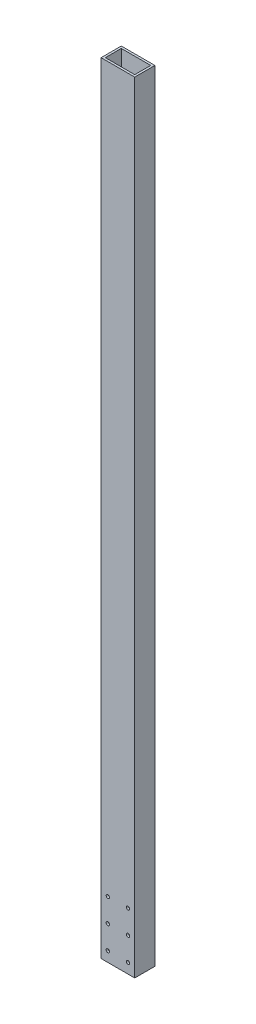
ISO-10303-21;
HEADER;
FILE_DESCRIPTION(('STEP AP214'),'2;1');
FILE_NAME('part.step','',(''),(''),'','','');
FILE_SCHEMA(('AUTOMOTIVE_DESIGN { 1 0 10303 214 1 1 1 1 }'));
ENDSEC;
DATA;
#1=APPLICATION_CONTEXT('core data for automotive mechanical design processes');
#2=APPLICATION_PROTOCOL_DEFINITION('international standard','automotive_design',2000,#1);
#3=PRODUCT_CONTEXT('',#1,'mechanical');
#4=PRODUCT('Part','Part','',(#3));
#5=PRODUCT_RELATED_PRODUCT_CATEGORY('part','',(#4));
#6=PRODUCT_DEFINITION_FORMATION('','',#4);
#7=PRODUCT_DEFINITION_CONTEXT('part definition',#1,'design');
#8=PRODUCT_DEFINITION('design','',#6,#7);
#9=PRODUCT_DEFINITION_SHAPE('','',#8);
#10=(LENGTH_UNIT() NAMED_UNIT(*) SI_UNIT(.MILLI.,.METRE.));
#11=(NAMED_UNIT(*) PLANE_ANGLE_UNIT() SI_UNIT($,.RADIAN.));
#12=(NAMED_UNIT(*) SI_UNIT($,.STERADIAN.) SOLID_ANGLE_UNIT());
#13=UNCERTAINTY_MEASURE_WITH_UNIT(LENGTH_MEASURE(1.E-05),#10,'distance_accuracy_value','');
#14=(GEOMETRIC_REPRESENTATION_CONTEXT(3) GLOBAL_UNCERTAINTY_ASSIGNED_CONTEXT((#13)) GLOBAL_UNIT_ASSIGNED_CONTEXT((#10,
#11,#12)) REPRESENTATION_CONTEXT('',''));
#15=CARTESIAN_POINT('',(0.,0.,0.));
#16=DIRECTION('',(0.,0.,1.));
#17=DIRECTION('',(1.,0.,0.));
#18=AXIS2_PLACEMENT_3D('',#15,#16,#17);
#19=CARTESIAN_POINT('',(0.,1473.2,0.));
#20=DIRECTION('',(0.,1.,0.));
#21=DIRECTION('',(0.,0.,-1.));
#22=AXIS2_PLACEMENT_3D('',#19,#20,#21);
#23=PLANE('',#22);
#24=DIRECTION('',(0.,0.,-1.));
#25=VECTOR('',#24,1.);
#26=CARTESIAN_POINT('',(-77.9742647058824,1473.2,-5.57181372549019));
#27=LINE('',#26,#25);
#28=CARTESIAN_POINT('',(-77.9742647058824,1473.2,32.5281862745098));
#29=VERTEX_POINT('',#28);
#30=CARTESIAN_POINT('',(-77.9742647058824,1473.2,-5.57181372549019));
#31=VERTEX_POINT('',#30);
#32=EDGE_CURVE('E140',#29,#31,#27,.T.);
#33=ORIENTED_EDGE('',*,*,#32,.F.);
#34=DIRECTION('',(-1.,0.,0.));
#35=VECTOR('',#34,1.);
#36=CARTESIAN_POINT('',(-77.9742647058824,1473.2,32.5281862745098));
#37=LINE('',#36,#35);
#38=CARTESIAN_POINT('',(-14.4742647058824,1473.2,32.5281862745098));
#39=VERTEX_POINT('',#38);
#40=EDGE_CURVE('E150',#39,#29,#37,.T.);
#41=ORIENTED_EDGE('',*,*,#40,.F.);
#42=DIRECTION('',(0.,0.,1.));
#43=VECTOR('',#42,1.);
#44=CARTESIAN_POINT('',(-14.4742647058824,1473.2,-5.57181372549019));
#45=LINE('',#44,#43);
#46=CARTESIAN_POINT('',(-14.4742647058824,1473.2,-5.57181372549019));
#47=VERTEX_POINT('',#46);
#48=EDGE_CURVE('E147',#47,#39,#45,.T.);
#49=ORIENTED_EDGE('',*,*,#48,.F.);
#50=DIRECTION('',(1.,0.,0.));
#51=VECTOR('',#50,1.);
#52=CARTESIAN_POINT('',(-77.9742647058824,1473.2,-5.57181372549019));
#53=LINE('',#52,#51);
#54=EDGE_CURVE('E143',#31,#47,#53,.T.);
#55=ORIENTED_EDGE('',*,*,#54,.F.);
#56=EDGE_LOOP('',(#33,#41,#49,#55));
#57=FACE_BOUND('',#56,.T.);
#58=DIRECTION('',(1.,0.,0.));
#59=VECTOR('',#58,1.);
#60=CARTESIAN_POINT('',(0.,1473.2,-1.60941372549019));
#61=LINE('',#60,#59);
#62=CARTESIAN_POINT('',(-74.0118647058824,1473.2,-1.60941372549019));
#63=VERTEX_POINT('',#62);
#64=CARTESIAN_POINT('',(-18.4366647058824,1473.2,-1.60941372549019));
#65=VERTEX_POINT('',#64);
#66=EDGE_CURVE('E119',#63,#65,#61,.T.);
#67=ORIENTED_EDGE('',*,*,#66,.T.);
#68=DIRECTION('',(0.,0.,1.));
#69=VECTOR('',#68,1.);
#70=CARTESIAN_POINT('',(-18.4366647058824,1473.2,0.));
#71=LINE('',#70,#69);
#72=CARTESIAN_POINT('',(-18.4366647058824,1473.2,28.5657862745098));
#73=VERTEX_POINT('',#72);
#74=EDGE_CURVE('E124',#65,#73,#71,.T.);
#75=ORIENTED_EDGE('',*,*,#74,.T.);
#76=DIRECTION('',(-1.,0.,0.));
#77=VECTOR('',#76,1.);
#78=CARTESIAN_POINT('',(0.,1473.2,28.5657862745098));
#79=LINE('',#78,#77);
#80=CARTESIAN_POINT('',(-74.0118647058824,1473.2,28.5657862745098));
#81=VERTEX_POINT('',#80);
#82=EDGE_CURVE('E120',#73,#81,#79,.T.);
#83=ORIENTED_EDGE('',*,*,#82,.T.);
#84=DIRECTION('',(0.,0.,-1.));
#85=VECTOR('',#84,1.);
#86=CARTESIAN_POINT('',(-74.0118647058824,1473.2,0.));
#87=LINE('',#86,#85);
#88=EDGE_CURVE('E105',#81,#63,#87,.T.);
#89=ORIENTED_EDGE('',*,*,#88,.T.);
#90=EDGE_LOOP('',(#67,#75,#83,#89));
#91=FACE_BOUND('',#90,.T.);
#92=ADVANCED_FACE('F37',(#57,#91),#23,.T.);
#93=CARTESIAN_POINT('',(0.,0.,0.));
#94=DIRECTION('',(0.,1.,0.));
#95=DIRECTION('',(0.,0.,-1.));
#96=AXIS2_PLACEMENT_3D('',#93,#94,#95);
#97=PLANE('',#96);
#98=DIRECTION('',(0.,0.,-1.));
#99=VECTOR('',#98,1.);
#100=CARTESIAN_POINT('',(-77.9742647058824,0.,-5.57181372549019));
#101=LINE('',#100,#99);
#102=CARTESIAN_POINT('',(-77.9742647058824,0.,32.5281862745098));
#103=VERTEX_POINT('',#102);
#104=CARTESIAN_POINT('',(-77.9742647058824,0.,-5.57181372549019));
#105=VERTEX_POINT('',#104);
#106=EDGE_CURVE('E113',#103,#105,#101,.T.);
#107=ORIENTED_EDGE('',*,*,#106,.T.);
#108=DIRECTION('',(1.,0.,0.));
#109=VECTOR('',#108,1.);
#110=CARTESIAN_POINT('',(-77.9742647058824,0.,-5.57181372549019));
#111=LINE('',#110,#109);
#112=CARTESIAN_POINT('',(-14.4742647058824,0.,-5.57181372549019));
#113=VERTEX_POINT('',#112);
#114=EDGE_CURVE('E156',#105,#113,#111,.T.);
#115=ORIENTED_EDGE('',*,*,#114,.T.);
#116=DIRECTION('',(0.,0.,1.));
#117=VECTOR('',#116,1.);
#118=CARTESIAN_POINT('',(-14.4742647058824,0.,-5.57181372549019));
#119=LINE('',#118,#117);
#120=CARTESIAN_POINT('',(-14.4742647058824,0.,32.5281862745098));
#121=VERTEX_POINT('',#120);
#122=EDGE_CURVE('E159',#113,#121,#119,.T.);
#123=ORIENTED_EDGE('',*,*,#122,.T.);
#124=DIRECTION('',(-1.,0.,0.));
#125=VECTOR('',#124,1.);
#126=CARTESIAN_POINT('',(-77.9742647058824,0.,32.5281862745098));
#127=LINE('',#126,#125);
#128=EDGE_CURVE('E144',#121,#103,#127,.T.);
#129=ORIENTED_EDGE('',*,*,#128,.T.);
#130=EDGE_LOOP('',(#107,#115,#123,#129));
#131=FACE_BOUND('',#130,.T.);
#132=DIRECTION('',(0.,0.,-1.));
#133=VECTOR('',#132,1.);
#134=CARTESIAN_POINT('',(-74.0118647058824,0.,0.));
#135=LINE('',#134,#133);
#136=CARTESIAN_POINT('',(-74.0118647058824,0.,28.5657862745098));
#137=VERTEX_POINT('',#136);
#138=CARTESIAN_POINT('',(-74.0118647058824,0.,-1.60941372549019));
#139=VERTEX_POINT('',#138);
#140=EDGE_CURVE('E108',#137,#139,#135,.T.);
#141=ORIENTED_EDGE('',*,*,#140,.F.);
#142=DIRECTION('',(-1.,0.,0.));
#143=VECTOR('',#142,1.);
#144=CARTESIAN_POINT('',(0.,0.,28.5657862745098));
#145=LINE('',#144,#143);
#146=CARTESIAN_POINT('',(-18.4366647058824,0.,28.5657862745098));
#147=VERTEX_POINT('',#146);
#148=EDGE_CURVE('E121',#147,#137,#145,.T.);
#149=ORIENTED_EDGE('',*,*,#148,.F.);
#150=DIRECTION('',(0.,0.,1.));
#151=VECTOR('',#150,1.);
#152=CARTESIAN_POINT('',(-18.4366647058824,0.,0.));
#153=LINE('',#152,#151);
#154=CARTESIAN_POINT('',(-18.4366647058824,0.,-1.60941372549019));
#155=VERTEX_POINT('',#154);
#156=EDGE_CURVE('E134',#155,#147,#153,.T.);
#157=ORIENTED_EDGE('',*,*,#156,.F.);
#158=DIRECTION('',(1.,0.,0.));
#159=VECTOR('',#158,1.);
#160=CARTESIAN_POINT('',(0.,0.,-1.60941372549019));
#161=LINE('',#160,#159);
#162=EDGE_CURVE('E131',#139,#155,#161,.T.);
#163=ORIENTED_EDGE('',*,*,#162,.F.);
#164=EDGE_LOOP('',(#141,#149,#157,#163));
#165=FACE_BOUND('',#164,.T.);
#166=ADVANCED_FACE('F329',(#131,#165),#97,.F.);
#167=CARTESIAN_POINT('',(-77.9742647058824,1473.2,-5.57181372549019));
#168=DIRECTION('',(1.,0.,0.));
#169=DIRECTION('',(0.,0.,1.));
#170=AXIS2_PLACEMENT_3D('',#167,#168,#169);
#171=PLANE('',#170);
#172=ORIENTED_EDGE('',*,*,#106,.F.);
#173=DIRECTION('',(0.,-1.,0.));
#174=VECTOR('',#173,1.);
#175=CARTESIAN_POINT('',(-77.9742647058824,1473.2,32.5281862745098));
#176=LINE('',#175,#174);
#177=EDGE_CURVE('E153',#29,#103,#176,.T.);
#178=ORIENTED_EDGE('',*,*,#177,.F.);
#179=ORIENTED_EDGE('',*,*,#32,.T.);
#180=DIRECTION('',(0.,-1.,0.));
#181=VECTOR('',#180,1.);
#182=CARTESIAN_POINT('',(-77.9742647058824,1473.2,-5.57181372549019));
#183=LINE('',#182,#181);
#184=EDGE_CURVE('E11',#31,#105,#183,.T.);
#185=ORIENTED_EDGE('',*,*,#184,.T.);
#186=EDGE_LOOP('',(#172,#178,#179,#185));
#187=FACE_BOUND('',#186,.T.);
#188=ADVANCED_FACE('F39',(#187),#171,.F.);
#189=CARTESIAN_POINT('',(-77.9742647058824,1473.2,-5.57181372549019));
#190=DIRECTION('',(0.,0.,1.));
#191=DIRECTION('',(-1.,0.,0.));
#192=AXIS2_PLACEMENT_3D('',#189,#190,#191);
#193=PLANE('',#192);
#194=CARTESIAN_POINT('',(-27.1742649276492,107.950000412582,-5.57181372549019));
#195=DIRECTION('',(0.,0.,-1.));
#196=DIRECTION('',(-1.,0.,0.));
#197=AXIS2_PLACEMENT_3D('',#194,#195,#196);
#198=CIRCLE('',#197,3.17499999999998);
#199=CARTESIAN_POINT('',(-30.3492649276492,107.950000412582,-5.57181372549019));
#200=VERTEX_POINT('',#199);
#201=EDGE_CURVE('E221',#200,#200,#198,.T.);
#202=ORIENTED_EDGE('',*,*,#201,.F.);
#203=EDGE_LOOP('',(#202));
#204=FACE_BOUND('',#203,.T.);
#205=CARTESIAN_POINT('',(-65.2742649276492,107.950000317398,-5.57181372549019));
#206=DIRECTION('',(0.,0.,-1.));
#207=DIRECTION('',(-1.,0.,0.));
#208=AXIS2_PLACEMENT_3D('',#205,#206,#207);
#209=CIRCLE('',#208,3.17499999999998);
#210=CARTESIAN_POINT('',(-68.4492649276491,107.950000317398,-5.57181372549019));
#211=VERTEX_POINT('',#210);
#212=EDGE_CURVE('E217',#211,#211,#209,.T.);
#213=ORIENTED_EDGE('',*,*,#212,.F.);
#214=EDGE_LOOP('',(#213));
#215=FACE_BOUND('',#214,.T.);
#216=CARTESIAN_POINT('',(-27.1742648166012,63.5000004125821,-5.57181372549019));
#217=DIRECTION('',(0.,0.,-1.));
#218=DIRECTION('',(-1.,0.,0.));
#219=AXIS2_PLACEMENT_3D('',#216,#217,#218);
#220=CIRCLE('',#219,3.17499999999998);
#221=CARTESIAN_POINT('',(-30.3492648166012,63.5000004125821,-5.57181372549019));
#222=VERTEX_POINT('',#221);
#223=EDGE_CURVE('E213',#222,#222,#220,.T.);
#224=ORIENTED_EDGE('',*,*,#223,.F.);
#225=EDGE_LOOP('',(#224));
#226=FACE_BOUND('',#225,.T.);
#227=CARTESIAN_POINT('',(-65.274264816601,63.5000003173981,-5.57181372549019));
#228=DIRECTION('',(0.,0.,-1.));
#229=DIRECTION('',(-1.,0.,0.));
#230=AXIS2_PLACEMENT_3D('',#227,#228,#229);
#231=CIRCLE('',#230,3.17499999999998);
#232=CARTESIAN_POINT('',(-68.4492648166009,63.5000003173981,-5.57181372549019));
#233=VERTEX_POINT('',#232);
#234=EDGE_CURVE('E208',#233,#233,#231,.T.);
#235=ORIENTED_EDGE('',*,*,#234,.F.);
#236=EDGE_LOOP('',(#235));
#237=FACE_BOUND('',#236,.T.);
#238=CARTESIAN_POINT('',(-27.1742647055528,19.050000412582,-5.57181372549019));
#239=DIRECTION('',(0.,0.,-1.));
#240=DIRECTION('',(-1.,0.,0.));
#241=AXIS2_PLACEMENT_3D('',#238,#239,#240);
#242=CIRCLE('',#241,3.17499999999998);
#243=CARTESIAN_POINT('',(-30.3492647055527,19.050000412582,-5.57181372549019));
#244=VERTEX_POINT('',#243);
#245=EDGE_CURVE('E203',#244,#244,#242,.T.);
#246=ORIENTED_EDGE('',*,*,#245,.F.);
#247=EDGE_LOOP('',(#246));
#248=FACE_BOUND('',#247,.T.);
#249=CARTESIAN_POINT('',(-65.274264705553,19.0500003173982,-5.57181372549019));
#250=DIRECTION('',(0.,0.,-1.));
#251=DIRECTION('',(-1.,0.,0.));
#252=AXIS2_PLACEMENT_3D('',#249,#250,#251);
#253=CIRCLE('',#252,3.17499999999998);
#254=CARTESIAN_POINT('',(-68.4492647055529,19.0500003173982,-5.57181372549019));
#255=VERTEX_POINT('',#254);
#256=EDGE_CURVE('E202',#255,#255,#253,.T.);
#257=ORIENTED_EDGE('',*,*,#256,.F.);
#258=EDGE_LOOP('',(#257));
#259=FACE_BOUND('',#258,.T.);
#260=CARTESIAN_POINT('',(-36.0642647058824,38.1,-5.57181372549019));
#261=DIRECTION('',(0.,0.,1.));
#262=DIRECTION('',(1.,0.,0.));
#263=AXIS2_PLACEMENT_3D('',#260,#261,#262);
#264=CIRCLE('',#263,2.01929999999999);
#265=CARTESIAN_POINT('',(-34.0449647058824,38.1,-5.57181372549019));
#266=VERTEX_POINT('',#265);
#267=EDGE_CURVE('E198',#266,#266,#264,.T.);
#268=ORIENTED_EDGE('',*,*,#267,.T.);
#269=EDGE_LOOP('',(#268));
#270=FACE_BOUND('',#269,.T.);
#271=CARTESIAN_POINT('',(-36.0642647058828,165.1,-5.57181372549019));
#272=DIRECTION('',(0.,0.,1.));
#273=DIRECTION('',(1.,0.,0.));
#274=AXIS2_PLACEMENT_3D('',#271,#272,#273);
#275=CIRCLE('',#274,2.01929999999999);
#276=CARTESIAN_POINT('',(-34.0449647058828,165.1,-5.57181372549019));
#277=VERTEX_POINT('',#276);
#278=EDGE_CURVE('E194',#277,#277,#275,.T.);
#279=ORIENTED_EDGE('',*,*,#278,.T.);
#280=EDGE_LOOP('',(#279));
#281=FACE_BOUND('',#280,.T.);
#282=CARTESIAN_POINT('',(-36.0642647058832,292.1,-5.57181372549019));
#283=DIRECTION('',(0.,0.,1.));
#284=DIRECTION('',(1.,0.,0.));
#285=AXIS2_PLACEMENT_3D('',#282,#283,#284);
#286=CIRCLE('',#285,2.01929999999999);
#287=CARTESIAN_POINT('',(-34.0449647058833,292.1,-5.57181372549019));
#288=VERTEX_POINT('',#287);
#289=EDGE_CURVE('E190',#288,#288,#286,.T.);
#290=ORIENTED_EDGE('',*,*,#289,.T.);
#291=EDGE_LOOP('',(#290));
#292=FACE_BOUND('',#291,.T.);
#293=CARTESIAN_POINT('',(-36.0642647058837,419.1,-5.57181372549019));
#294=DIRECTION('',(0.,0.,1.));
#295=DIRECTION('',(1.,0.,0.));
#296=AXIS2_PLACEMENT_3D('',#293,#294,#295);
#297=CIRCLE('',#296,2.01929999999999);
#298=CARTESIAN_POINT('',(-34.0449647058837,419.1,-5.57181372549019));
#299=VERTEX_POINT('',#298);
#300=EDGE_CURVE('E186',#299,#299,#297,.T.);
#301=ORIENTED_EDGE('',*,*,#300,.T.);
#302=EDGE_LOOP('',(#301));
#303=FACE_BOUND('',#302,.T.);
#304=CARTESIAN_POINT('',(-36.0642647058841,546.1,-5.57181372549019));
#305=DIRECTION('',(0.,0.,1.));
#306=DIRECTION('',(1.,0.,0.));
#307=AXIS2_PLACEMENT_3D('',#304,#305,#306);
#308=CIRCLE('',#307,2.01929999999999);
#309=CARTESIAN_POINT('',(-34.0449647058841,546.1,-5.57181372549019));
#310=VERTEX_POINT('',#309);
#311=EDGE_CURVE('E182',#310,#310,#308,.T.);
#312=ORIENTED_EDGE('',*,*,#311,.T.);
#313=EDGE_LOOP('',(#312));
#314=FACE_BOUND('',#313,.T.);
#315=CARTESIAN_POINT('',(-36.0642647058846,673.1,-5.57181372549019));
#316=DIRECTION('',(0.,0.,1.));
#317=DIRECTION('',(1.,0.,0.));
#318=AXIS2_PLACEMENT_3D('',#315,#316,#317);
#319=CIRCLE('',#318,2.01929999999999);
#320=CARTESIAN_POINT('',(-34.0449647058846,673.1,-5.57181372549019));
#321=VERTEX_POINT('',#320);
#322=EDGE_CURVE('E181',#321,#321,#319,.T.);
#323=ORIENTED_EDGE('',*,*,#322,.T.);
#324=EDGE_LOOP('',(#323));
#325=FACE_BOUND('',#324,.T.);
#326=CARTESIAN_POINT('',(-36.064264705885,800.1,-5.57181372549019));
#327=DIRECTION('',(0.,0.,1.));
#328=DIRECTION('',(1.,0.,0.));
#329=AXIS2_PLACEMENT_3D('',#326,#327,#328);
#330=CIRCLE('',#329,2.01929999999999);
#331=CARTESIAN_POINT('',(-34.044964705885,800.1,-5.57181372549019));
#332=VERTEX_POINT('',#331);
#333=EDGE_CURVE('E285',#332,#332,#330,.T.);
#334=ORIENTED_EDGE('',*,*,#333,.T.);
#335=EDGE_LOOP('',(#334));
#336=FACE_BOUND('',#335,.T.);
#337=CARTESIAN_POINT('',(-36.0642647058855,927.1,-5.57181372549019));
#338=DIRECTION('',(0.,0.,1.));
#339=DIRECTION('',(1.,0.,0.));
#340=AXIS2_PLACEMENT_3D('',#337,#338,#339);
#341=CIRCLE('',#340,2.01929999999999);
#342=CARTESIAN_POINT('',(-34.0449647058855,927.1,-5.57181372549019));
#343=VERTEX_POINT('',#342);
#344=EDGE_CURVE('E291',#343,#343,#341,.T.);
#345=ORIENTED_EDGE('',*,*,#344,.T.);
#346=EDGE_LOOP('',(#345));
#347=FACE_BOUND('',#346,.T.);
#348=CARTESIAN_POINT('',(-36.0642647058859,1054.1,-5.57181372549019));
#349=DIRECTION('',(0.,0.,1.));
#350=DIRECTION('',(1.,0.,0.));
#351=AXIS2_PLACEMENT_3D('',#348,#349,#350);
#352=CIRCLE('',#351,2.01929999999999);
#353=CARTESIAN_POINT('',(-34.0449647058859,1054.1,-5.57181372549019));
#354=VERTEX_POINT('',#353);
#355=EDGE_CURVE('E177',#354,#354,#352,.T.);
#356=ORIENTED_EDGE('',*,*,#355,.T.);
#357=EDGE_LOOP('',(#356));
#358=FACE_BOUND('',#357,.T.);
#359=CARTESIAN_POINT('',(-36.0642647058863,1181.1,-5.57181372549019));
#360=DIRECTION('',(0.,0.,1.));
#361=DIRECTION('',(1.,0.,0.));
#362=AXIS2_PLACEMENT_3D('',#359,#360,#361);
#363=CIRCLE('',#362,2.01929999999999);
#364=CARTESIAN_POINT('',(-34.0449647058864,1181.1,-5.57181372549019));
#365=VERTEX_POINT('',#364);
#366=EDGE_CURVE('E176',#365,#365,#363,.T.);
#367=ORIENTED_EDGE('',*,*,#366,.T.);
#368=EDGE_LOOP('',(#367));
#369=FACE_BOUND('',#368,.T.);
#370=CARTESIAN_POINT('',(-36.0642647058868,1308.1,-5.57181372549019));
#371=DIRECTION('',(0.,0.,1.));
#372=DIRECTION('',(1.,0.,0.));
#373=AXIS2_PLACEMENT_3D('',#370,#371,#372);
#374=CIRCLE('',#373,2.01929999999999);
#375=CARTESIAN_POINT('',(-34.0449647058868,1308.1,-5.57181372549019));
#376=VERTEX_POINT('',#375);
#377=EDGE_CURVE('E172',#376,#376,#374,.T.);
#378=ORIENTED_EDGE('',*,*,#377,.T.);
#379=EDGE_LOOP('',(#378));
#380=FACE_BOUND('',#379,.T.);
#381=CARTESIAN_POINT('',(-36.0642647058872,1435.1,-5.57181372549019));
#382=DIRECTION('',(0.,0.,1.));
#383=DIRECTION('',(1.,0.,0.));
#384=AXIS2_PLACEMENT_3D('',#381,#382,#383);
#385=CIRCLE('',#384,2.01929999999999);
#386=CARTESIAN_POINT('',(-34.0449647058872,1435.1,-5.57181372549019));
#387=VERTEX_POINT('',#386);
#388=EDGE_CURVE('E171',#387,#387,#385,.T.);
#389=ORIENTED_EDGE('',*,*,#388,.T.);
#390=EDGE_LOOP('',(#389));
#391=FACE_BOUND('',#390,.T.);
#392=ORIENTED_EDGE('',*,*,#114,.F.);
#393=ORIENTED_EDGE('',*,*,#184,.F.);
#394=ORIENTED_EDGE('',*,*,#54,.T.);
#395=DIRECTION('',(0.,-1.,0.));
#396=VECTOR('',#395,1.);
#397=CARTESIAN_POINT('',(-14.4742647058824,1473.2,-5.57181372549019));
#398=LINE('',#397,#396);
#399=EDGE_CURVE('E46',#47,#113,#398,.T.);
#400=ORIENTED_EDGE('',*,*,#399,.T.);
#401=EDGE_LOOP('',(#392,#393,#394,#400));
#402=FACE_BOUND('',#401,.T.);
#403=ADVANCED_FACE('F319',(#204,#215,#226,#237,#248,#259,#270,#281,#292,#303,#314,#325,#336,
#347,#358,#369,#380,#391,#402),#193,.F.);
#404=CARTESIAN_POINT('',(-14.4742647058824,1473.2,-5.57181372549019));
#405=DIRECTION('',(-1.,0.,0.));
#406=DIRECTION('',(0.,0.,-1.));
#407=AXIS2_PLACEMENT_3D('',#404,#405,#406);
#408=PLANE('',#407);
#409=ORIENTED_EDGE('',*,*,#122,.F.);
#410=ORIENTED_EDGE('',*,*,#399,.F.);
#411=ORIENTED_EDGE('',*,*,#48,.T.);
#412=DIRECTION('',(0.,-1.,0.));
#413=VECTOR('',#412,1.);
#414=CARTESIAN_POINT('',(-14.4742647058824,1473.2,32.5281862745098));
#415=LINE('',#414,#413);
#416=EDGE_CURVE('E165',#39,#121,#415,.T.);
#417=ORIENTED_EDGE('',*,*,#416,.T.);
#418=EDGE_LOOP('',(#409,#410,#411,#417));
#419=FACE_BOUND('',#418,.T.);
#420=ADVANCED_FACE('F322',(#419),#408,.F.);
#421=CARTESIAN_POINT('',(-77.9742647058824,1473.2,32.5281862745098));
#422=DIRECTION('',(0.,0.,-1.));
#423=DIRECTION('',(1.,0.,0.));
#424=AXIS2_PLACEMENT_3D('',#421,#422,#423);
#425=PLANE('',#424);
#426=CARTESIAN_POINT('',(-27.1742649332025,107.950000412582,32.5281862745098));
#427=DIRECTION('',(0.,0.,1.));
#428=DIRECTION('',(1.,0.,0.));
#429=AXIS2_PLACEMENT_3D('',#426,#427,#428);
#430=CIRCLE('',#429,3.17499999999998);
#431=CARTESIAN_POINT('',(-23.9992649332025,107.950000412582,32.5281862745098));
#432=VERTEX_POINT('',#431);
#433=EDGE_CURVE('E228',#432,#432,#430,.T.);
#434=ORIENTED_EDGE('',*,*,#433,.F.);
#435=EDGE_LOOP('',(#434));
#436=FACE_BOUND('',#435,.T.);
#437=CARTESIAN_POINT('',(-65.2742649332025,107.950000317398,32.5281862745098));
#438=DIRECTION('',(0.,0.,1.));
#439=DIRECTION('',(1.,0.,0.));
#440=AXIS2_PLACEMENT_3D('',#437,#438,#439);
#441=CIRCLE('',#440,3.17499999999998);
#442=CARTESIAN_POINT('',(-62.0992649332025,107.950000317398,32.5281862745098));
#443=VERTEX_POINT('',#442);
#444=EDGE_CURVE('E225',#443,#443,#441,.T.);
#445=ORIENTED_EDGE('',*,*,#444,.F.);
#446=EDGE_LOOP('',(#445));
#447=FACE_BOUND('',#446,.T.);
#448=CARTESIAN_POINT('',(-27.1742648221545,63.5000004125821,32.5281862745098));
#449=DIRECTION('',(0.,0.,1.));
#450=DIRECTION('',(1.,0.,0.));
#451=AXIS2_PLACEMENT_3D('',#448,#449,#450);
#452=CIRCLE('',#451,3.17499999999998);
#453=CARTESIAN_POINT('',(-23.9992648221545,63.5000004125821,32.5281862745098));
#454=VERTEX_POINT('',#453);
#455=EDGE_CURVE('E243',#454,#454,#452,.T.);
#456=ORIENTED_EDGE('',*,*,#455,.F.);
#457=EDGE_LOOP('',(#456));
#458=FACE_BOUND('',#457,.T.);
#459=CARTESIAN_POINT('',(-65.2742648221543,63.5000003173981,32.5281862745098));
#460=DIRECTION('',(0.,0.,1.));
#461=DIRECTION('',(1.,0.,0.));
#462=AXIS2_PLACEMENT_3D('',#459,#460,#461);
#463=CIRCLE('',#462,3.17499999999998);
#464=CARTESIAN_POINT('',(-62.0992648221543,63.5000003173981,32.5281862745098));
#465=VERTEX_POINT('',#464);
#466=EDGE_CURVE('E250',#465,#465,#463,.T.);
#467=ORIENTED_EDGE('',*,*,#466,.F.);
#468=EDGE_LOOP('',(#467));
#469=FACE_BOUND('',#468,.T.);
#470=CARTESIAN_POINT('',(-27.1742647111061,19.050000412582,32.5281862745098));
#471=DIRECTION('',(0.,0.,1.));
#472=DIRECTION('',(1.,0.,0.));
#473=AXIS2_PLACEMENT_3D('',#470,#471,#472);
#474=CIRCLE('',#473,3.17499999999998);
#475=CARTESIAN_POINT('',(-23.9992647111061,19.050000412582,32.5281862745098));
#476=VERTEX_POINT('',#475);
#477=EDGE_CURVE('E257',#476,#476,#474,.T.);
#478=ORIENTED_EDGE('',*,*,#477,.F.);
#479=EDGE_LOOP('',(#478));
#480=FACE_BOUND('',#479,.T.);
#481=CARTESIAN_POINT('',(-65.2742647111063,19.0500003173982,32.5281862745098));
#482=DIRECTION('',(0.,0.,1.));
#483=DIRECTION('',(1.,0.,0.));
#484=AXIS2_PLACEMENT_3D('',#481,#482,#483);
#485=CIRCLE('',#484,3.17499999999998);
#486=CARTESIAN_POINT('',(-62.0992647111063,19.0500003173982,32.5281862745098));
#487=VERTEX_POINT('',#486);
#488=EDGE_CURVE('E267',#487,#487,#485,.T.);
#489=ORIENTED_EDGE('',*,*,#488,.F.);
#490=EDGE_LOOP('',(#489));
#491=FACE_BOUND('',#490,.T.);
#492=ORIENTED_EDGE('',*,*,#128,.F.);
#493=ORIENTED_EDGE('',*,*,#416,.F.);
#494=ORIENTED_EDGE('',*,*,#40,.T.);
#495=ORIENTED_EDGE('',*,*,#177,.T.);
#496=EDGE_LOOP('',(#492,#493,#494,#495));
#497=FACE_BOUND('',#496,.T.);
#498=ADVANCED_FACE('F339',(#436,#447,#458,#469,#480,#491,#497),#425,.F.);
#499=CARTESIAN_POINT('',(-74.0118647058824,1473.2,0.));
#500=DIRECTION('',(1.,0.,0.));
#501=DIRECTION('',(0.,0.,1.));
#502=AXIS2_PLACEMENT_3D('',#499,#500,#501);
#503=PLANE('',#502);
#504=ORIENTED_EDGE('',*,*,#140,.T.);
#505=DIRECTION('',(0.,-1.,0.));
#506=VECTOR('',#505,1.);
#507=CARTESIAN_POINT('',(-74.0118647058824,1473.2,-1.60941372549019));
#508=LINE('',#507,#506);
#509=EDGE_CURVE('E102',#63,#139,#508,.T.);
#510=ORIENTED_EDGE('',*,*,#509,.F.);
#511=ORIENTED_EDGE('',*,*,#88,.F.);
#512=DIRECTION('',(0.,-1.,0.));
#513=VECTOR('',#512,1.);
#514=CARTESIAN_POINT('',(-74.0118647058824,1473.2,28.5657862745098));
#515=LINE('',#514,#513);
#516=EDGE_CURVE('E62',#81,#137,#515,.T.);
#517=ORIENTED_EDGE('',*,*,#516,.T.);
#518=EDGE_LOOP('',(#504,#510,#511,#517));
#519=FACE_BOUND('',#518,.T.);
#520=ADVANCED_FACE('F104',(#519),#503,.T.);
#521=CARTESIAN_POINT('',(0.,1473.2,-1.60941372549019));
#522=DIRECTION('',(0.,0.,1.));
#523=DIRECTION('',(-1.,0.,0.));
#524=AXIS2_PLACEMENT_3D('',#521,#522,#523);
#525=PLANE('',#524);
#526=CARTESIAN_POINT('',(-27.1742649282268,107.950000412582,-1.60941372549019));
#527=DIRECTION('',(0.,0.,-1.));
#528=DIRECTION('',(-1.,0.,0.));
#529=AXIS2_PLACEMENT_3D('',#526,#527,#528);
#530=CIRCLE('',#529,3.17499999999998);
#531=CARTESIAN_POINT('',(-30.3492649282267,107.950000412582,-1.60941372549019));
#532=VERTEX_POINT('',#531);
#533=EDGE_CURVE('E41',#532,#532,#530,.T.);
#534=ORIENTED_EDGE('',*,*,#533,.T.);
#535=EDGE_LOOP('',(#534));
#536=FACE_BOUND('',#535,.T.);
#537=CARTESIAN_POINT('',(-65.2742649282267,107.950000317398,-1.60941372549019));
#538=DIRECTION('',(0.,0.,-1.));
#539=DIRECTION('',(-1.,0.,0.));
#540=AXIS2_PLACEMENT_3D('',#537,#538,#539);
#541=CIRCLE('',#540,3.17499999999998);
#542=CARTESIAN_POINT('',(-68.4492649282267,107.950000317398,-1.60941372549019));
#543=VERTEX_POINT('',#542);
#544=EDGE_CURVE('E218',#543,#543,#541,.T.);
#545=ORIENTED_EDGE('',*,*,#544,.T.);
#546=EDGE_LOOP('',(#545));
#547=FACE_BOUND('',#546,.T.);
#548=CARTESIAN_POINT('',(-27.1742648171788,63.5000004125821,-1.60941372549019));
#549=DIRECTION('',(0.,0.,-1.));
#550=DIRECTION('',(-1.,0.,0.));
#551=AXIS2_PLACEMENT_3D('',#548,#549,#550);
#552=CIRCLE('',#551,3.17499999999998);
#553=CARTESIAN_POINT('',(-30.3492648171787,63.5000004125821,-1.60941372549019));
#554=VERTEX_POINT('',#553);
#555=EDGE_CURVE('E214',#554,#554,#552,.T.);
#556=ORIENTED_EDGE('',*,*,#555,.T.);
#557=EDGE_LOOP('',(#556));
#558=FACE_BOUND('',#557,.T.);
#559=CARTESIAN_POINT('',(-65.2742648171785,63.5000003173981,-1.60941372549019));
#560=DIRECTION('',(0.,0.,-1.));
#561=DIRECTION('',(-1.,0.,0.));
#562=AXIS2_PLACEMENT_3D('',#559,#560,#561);
#563=CIRCLE('',#562,3.17499999999998);
#564=CARTESIAN_POINT('',(-68.4492648171785,63.5000003173981,-1.60941372549019));
#565=VERTEX_POINT('',#564);
#566=EDGE_CURVE('E209',#565,#565,#563,.T.);
#567=ORIENTED_EDGE('',*,*,#566,.T.);
#568=EDGE_LOOP('',(#567));
#569=FACE_BOUND('',#568,.T.);
#570=CARTESIAN_POINT('',(-27.1742647061303,19.050000412582,-1.60941372549019));
#571=DIRECTION('',(0.,0.,-1.));
#572=DIRECTION('',(-1.,0.,0.));
#573=AXIS2_PLACEMENT_3D('',#570,#571,#572);
#574=CIRCLE('',#573,3.17499999999998);
#575=CARTESIAN_POINT('',(-30.3492647061303,19.050000412582,-1.60941372549019));
#576=VERTEX_POINT('',#575);
#577=EDGE_CURVE('E204',#576,#576,#574,.T.);
#578=ORIENTED_EDGE('',*,*,#577,.T.);
#579=EDGE_LOOP('',(#578));
#580=FACE_BOUND('',#579,.T.);
#581=CARTESIAN_POINT('',(-65.2742647061305,19.0500003173982,-1.60941372549019));
#582=DIRECTION('',(0.,0.,-1.));
#583=DIRECTION('',(-1.,0.,0.));
#584=AXIS2_PLACEMENT_3D('',#581,#582,#583);
#585=CIRCLE('',#584,3.17499999999998);
#586=CARTESIAN_POINT('',(-68.4492647061305,19.0500003173982,-1.60941372549019));
#587=VERTEX_POINT('',#586);
#588=EDGE_CURVE('E199',#587,#587,#585,.T.);
#589=ORIENTED_EDGE('',*,*,#588,.T.);
#590=EDGE_LOOP('',(#589));
#591=FACE_BOUND('',#590,.T.);
#592=CARTESIAN_POINT('',(-36.0642647058824,38.1,-1.60941372549019));
#593=DIRECTION('',(0.,0.,-1.));
#594=DIRECTION('',(-1.,0.,0.));
#595=AXIS2_PLACEMENT_3D('',#592,#593,#594);
#596=CIRCLE('',#595,2.01929999999999);
#597=CARTESIAN_POINT('',(-38.0835647058823,38.1,-1.60941372549019));
#598=VERTEX_POINT('',#597);
#599=EDGE_CURVE('E195',#598,#598,#596,.T.);
#600=ORIENTED_EDGE('',*,*,#599,.T.);
#601=EDGE_LOOP('',(#600));
#602=FACE_BOUND('',#601,.T.);
#603=CARTESIAN_POINT('',(-36.0642647058828,165.1,-1.60941372549019));
#604=DIRECTION('',(0.,0.,-1.));
#605=DIRECTION('',(-1.,0.,0.));
#606=AXIS2_PLACEMENT_3D('',#603,#604,#605);
#607=CIRCLE('',#606,2.01929999999999);
#608=CARTESIAN_POINT('',(-38.0835647058828,165.1,-1.60941372549019));
#609=VERTEX_POINT('',#608);
#610=EDGE_CURVE('E191',#609,#609,#607,.T.);
#611=ORIENTED_EDGE('',*,*,#610,.T.);
#612=EDGE_LOOP('',(#611));
#613=FACE_BOUND('',#612,.T.);
#614=CARTESIAN_POINT('',(-36.0642647058832,292.1,-1.60941372549019));
#615=DIRECTION('',(0.,0.,-1.));
#616=DIRECTION('',(-1.,0.,0.));
#617=AXIS2_PLACEMENT_3D('',#614,#615,#616);
#618=CIRCLE('',#617,2.01929999999999);
#619=CARTESIAN_POINT('',(-38.0835647058832,292.1,-1.60941372549019));
#620=VERTEX_POINT('',#619);
#621=EDGE_CURVE('E187',#620,#620,#618,.T.);
#622=ORIENTED_EDGE('',*,*,#621,.T.);
#623=EDGE_LOOP('',(#622));
#624=FACE_BOUND('',#623,.T.);
#625=CARTESIAN_POINT('',(-36.0642647058837,419.1,-1.60941372549019));
#626=DIRECTION('',(0.,0.,-1.));
#627=DIRECTION('',(-1.,0.,0.));
#628=AXIS2_PLACEMENT_3D('',#625,#626,#627);
#629=CIRCLE('',#628,2.01929999999999);
#630=CARTESIAN_POINT('',(-38.0835647058837,419.1,-1.60941372549019));
#631=VERTEX_POINT('',#630);
#632=EDGE_CURVE('E183',#631,#631,#629,.T.);
#633=ORIENTED_EDGE('',*,*,#632,.T.);
#634=EDGE_LOOP('',(#633));
#635=FACE_BOUND('',#634,.T.);
#636=CARTESIAN_POINT('',(-36.0642647058841,546.1,-1.60941372549019));
#637=DIRECTION('',(0.,0.,-1.));
#638=DIRECTION('',(-1.,0.,0.));
#639=AXIS2_PLACEMENT_3D('',#636,#637,#638);
#640=CIRCLE('',#639,2.01929999999999);
#641=CARTESIAN_POINT('',(-38.0835647058841,546.1,-1.60941372549019));
#642=VERTEX_POINT('',#641);
#643=EDGE_CURVE('E178',#642,#642,#640,.T.);
#644=ORIENTED_EDGE('',*,*,#643,.T.);
#645=EDGE_LOOP('',(#644));
#646=FACE_BOUND('',#645,.T.);
#647=CARTESIAN_POINT('',(-36.0642647058846,673.1,-1.60941372549019));
#648=DIRECTION('',(0.,0.,-1.));
#649=DIRECTION('',(-1.,0.,0.));
#650=AXIS2_PLACEMENT_3D('',#647,#648,#649);
#651=CIRCLE('',#650,2.01929999999999);
#652=CARTESIAN_POINT('',(-38.0835647058846,673.1,-1.60941372549019));
#653=VERTEX_POINT('',#652);
#654=EDGE_CURVE('E282',#653,#653,#651,.T.);
#655=ORIENTED_EDGE('',*,*,#654,.T.);
#656=EDGE_LOOP('',(#655));
#657=FACE_BOUND('',#656,.T.);
#658=CARTESIAN_POINT('',(-36.064264705885,800.1,-1.60941372549019));
#659=DIRECTION('',(0.,0.,-1.));
#660=DIRECTION('',(-1.,0.,0.));
#661=AXIS2_PLACEMENT_3D('',#658,#659,#660);
#662=CIRCLE('',#661,2.01929999999999);
#663=CARTESIAN_POINT('',(-38.083564705885,800.1,-1.60941372549019));
#664=VERTEX_POINT('',#663);
#665=EDGE_CURVE('E288',#664,#664,#662,.T.);
#666=ORIENTED_EDGE('',*,*,#665,.T.);
#667=EDGE_LOOP('',(#666));
#668=FACE_BOUND('',#667,.T.);
#669=CARTESIAN_POINT('',(-36.0642647058855,927.1,-1.60941372549019));
#670=DIRECTION('',(0.,0.,-1.));
#671=DIRECTION('',(-1.,0.,0.));
#672=AXIS2_PLACEMENT_3D('',#669,#670,#671);
#673=CIRCLE('',#672,2.01929999999999);
#674=CARTESIAN_POINT('',(-38.0835647058855,927.1,-1.60941372549019));
#675=VERTEX_POINT('',#674);
#676=EDGE_CURVE('E294',#675,#675,#673,.T.);
#677=ORIENTED_EDGE('',*,*,#676,.T.);
#678=EDGE_LOOP('',(#677));
#679=FACE_BOUND('',#678,.T.);
#680=CARTESIAN_POINT('',(-36.0642647058859,1054.1,-1.60941372549019));
#681=DIRECTION('',(0.,0.,-1.));
#682=DIRECTION('',(-1.,0.,0.));
#683=AXIS2_PLACEMENT_3D('',#680,#681,#682);
#684=CIRCLE('',#683,2.01929999999999);
#685=CARTESIAN_POINT('',(-38.0835647058859,1054.1,-1.60941372549019));
#686=VERTEX_POINT('',#685);
#687=EDGE_CURVE('E173',#686,#686,#684,.T.);
#688=ORIENTED_EDGE('',*,*,#687,.T.);
#689=EDGE_LOOP('',(#688));
#690=FACE_BOUND('',#689,.T.);
#691=CARTESIAN_POINT('',(-36.0642647058863,1181.1,-1.60941372549019));
#692=DIRECTION('',(0.,0.,-1.));
#693=DIRECTION('',(-1.,0.,0.));
#694=AXIS2_PLACEMENT_3D('',#691,#692,#693);
#695=CIRCLE('',#694,2.01929999999999);
#696=CARTESIAN_POINT('',(-38.0835647058863,1181.1,-1.60941372549019));
#697=VERTEX_POINT('',#696);
#698=EDGE_CURVE('E301',#697,#697,#695,.T.);
#699=ORIENTED_EDGE('',*,*,#698,.T.);
#700=EDGE_LOOP('',(#699));
#701=FACE_BOUND('',#700,.T.);
#702=CARTESIAN_POINT('',(-36.0642647058868,1308.1,-1.60941372549019));
#703=DIRECTION('',(0.,0.,-1.));
#704=DIRECTION('',(-1.,0.,0.));
#705=AXIS2_PLACEMENT_3D('',#702,#703,#704);
#706=CIRCLE('',#705,2.01929999999999);
#707=CARTESIAN_POINT('',(-38.0835647058868,1308.1,-1.60941372549019));
#708=VERTEX_POINT('',#707);
#709=EDGE_CURVE('E168',#708,#708,#706,.T.);
#710=ORIENTED_EDGE('',*,*,#709,.T.);
#711=EDGE_LOOP('',(#710));
#712=FACE_BOUND('',#711,.T.);
#713=CARTESIAN_POINT('',(-36.0642647058872,1435.1,-1.60941372549019));
#714=DIRECTION('',(0.,0.,-1.));
#715=DIRECTION('',(-1.,0.,0.));
#716=AXIS2_PLACEMENT_3D('',#713,#714,#715);
#717=CIRCLE('',#716,2.01929999999999);
#718=CARTESIAN_POINT('',(-38.0835647058872,1435.1,-1.60941372549019));
#719=VERTEX_POINT('',#718);
#720=EDGE_CURVE('E132',#719,#719,#717,.T.);
#721=ORIENTED_EDGE('',*,*,#720,.T.);
#722=EDGE_LOOP('',(#721));
#723=FACE_BOUND('',#722,.T.);
#724=ORIENTED_EDGE('',*,*,#162,.T.);
#725=DIRECTION('',(0.,-1.,0.));
#726=VECTOR('',#725,1.);
#727=CARTESIAN_POINT('',(-18.4366647058824,1473.2,-1.60941372549019));
#728=LINE('',#727,#726);
#729=EDGE_CURVE('E114',#65,#155,#728,.T.);
#730=ORIENTED_EDGE('',*,*,#729,.F.);
#731=ORIENTED_EDGE('',*,*,#66,.F.);
#732=ORIENTED_EDGE('',*,*,#509,.T.);
#733=EDGE_LOOP('',(#724,#730,#731,#732));
#734=FACE_BOUND('',#733,.T.);
#735=ADVANCED_FACE('F123',(#536,#547,#558,#569,#580,#591,#602,#613,#624,#635,#646,#657,#668,
#679,#690,#701,#712,#723,#734),#525,.T.);
#736=CARTESIAN_POINT('',(-18.4366647058824,1473.2,0.));
#737=DIRECTION('',(-1.,0.,0.));
#738=DIRECTION('',(0.,0.,-1.));
#739=AXIS2_PLACEMENT_3D('',#736,#737,#738);
#740=PLANE('',#739);
#741=ORIENTED_EDGE('',*,*,#156,.T.);
#742=DIRECTION('',(0.,-1.,0.));
#743=VECTOR('',#742,1.);
#744=CARTESIAN_POINT('',(-18.4366647058824,1473.2,28.5657862745098));
#745=LINE('',#744,#743);
#746=EDGE_CURVE('E54',#73,#147,#745,.T.);
#747=ORIENTED_EDGE('',*,*,#746,.F.);
#748=ORIENTED_EDGE('',*,*,#74,.F.);
#749=ORIENTED_EDGE('',*,*,#729,.T.);
#750=EDGE_LOOP('',(#741,#747,#748,#749));
#751=FACE_BOUND('',#750,.T.);
#752=ADVANCED_FACE('F360',(#751),#740,.T.);
#753=CARTESIAN_POINT('',(0.,1473.2,28.5657862745098));
#754=DIRECTION('',(0.,0.,-1.));
#755=DIRECTION('',(1.,0.,0.));
#756=AXIS2_PLACEMENT_3D('',#753,#754,#755);
#757=PLANE('',#756);
#758=CARTESIAN_POINT('',(-27.174264932625,107.950000412582,28.5657862745098));
#759=DIRECTION('',(0.,0.,1.));
#760=DIRECTION('',(1.,0.,0.));
#761=AXIS2_PLACEMENT_3D('',#758,#759,#760);
#762=CIRCLE('',#761,3.17499999999998);
#763=CARTESIAN_POINT('',(-23.999264932625,107.950000412582,28.5657862745098));
#764=VERTEX_POINT('',#763);
#765=EDGE_CURVE('E233',#764,#764,#762,.T.);
#766=ORIENTED_EDGE('',*,*,#765,.T.);
#767=EDGE_LOOP('',(#766));
#768=FACE_BOUND('',#767,.T.);
#769=CARTESIAN_POINT('',(-65.2742649326249,107.950000317398,28.5657862745098));
#770=DIRECTION('',(0.,0.,1.));
#771=DIRECTION('',(1.,0.,0.));
#772=AXIS2_PLACEMENT_3D('',#769,#770,#771);
#773=CIRCLE('',#772,3.17499999999998);
#774=CARTESIAN_POINT('',(-62.0992649326249,107.950000317398,28.5657862745098));
#775=VERTEX_POINT('',#774);
#776=EDGE_CURVE('E220',#775,#775,#773,.T.);
#777=ORIENTED_EDGE('',*,*,#776,.T.);
#778=EDGE_LOOP('',(#777));
#779=FACE_BOUND('',#778,.T.);
#780=CARTESIAN_POINT('',(-27.174264821577,63.5000004125821,28.5657862745098));
#781=DIRECTION('',(0.,0.,1.));
#782=DIRECTION('',(1.,0.,0.));
#783=AXIS2_PLACEMENT_3D('',#780,#781,#782);
#784=CIRCLE('',#783,3.17499999999998);
#785=CARTESIAN_POINT('',(-23.999264821577,63.5000004125821,28.5657862745098));
#786=VERTEX_POINT('',#785);
#787=EDGE_CURVE('E216',#786,#786,#784,.T.);
#788=ORIENTED_EDGE('',*,*,#787,.T.);
#789=EDGE_LOOP('',(#788));
#790=FACE_BOUND('',#789,.T.);
#791=CARTESIAN_POINT('',(-65.2742648215767,63.5000003173981,28.5657862745098));
#792=DIRECTION('',(0.,0.,1.));
#793=DIRECTION('',(1.,0.,0.));
#794=AXIS2_PLACEMENT_3D('',#791,#792,#793);
#795=CIRCLE('',#794,3.17499999999998);
#796=CARTESIAN_POINT('',(-62.0992648215767,63.5000003173981,28.5657862745098));
#797=VERTEX_POINT('',#796);
#798=EDGE_CURVE('E212',#797,#797,#795,.T.);
#799=ORIENTED_EDGE('',*,*,#798,.T.);
#800=EDGE_LOOP('',(#799));
#801=FACE_BOUND('',#800,.T.);
#802=CARTESIAN_POINT('',(-27.1742647105285,19.050000412582,28.5657862745098));
#803=DIRECTION('',(0.,0.,1.));
#804=DIRECTION('',(1.,0.,0.));
#805=AXIS2_PLACEMENT_3D('',#802,#803,#804);
#806=CIRCLE('',#805,3.17499999999998);
#807=CARTESIAN_POINT('',(-23.9992647105285,19.050000412582,28.5657862745098));
#808=VERTEX_POINT('',#807);
#809=EDGE_CURVE('E207',#808,#808,#806,.T.);
#810=ORIENTED_EDGE('',*,*,#809,.T.);
#811=EDGE_LOOP('',(#810));
#812=FACE_BOUND('',#811,.T.);
#813=CARTESIAN_POINT('',(-65.2742647105287,19.0500003173982,28.5657862745098));
#814=DIRECTION('',(0.,0.,1.));
#815=DIRECTION('',(1.,0.,0.));
#816=AXIS2_PLACEMENT_3D('',#813,#814,#815);
#817=CIRCLE('',#816,3.17499999999998);
#818=CARTESIAN_POINT('',(-62.0992647105287,19.0500003173982,28.5657862745098));
#819=VERTEX_POINT('',#818);
#820=EDGE_CURVE('E264',#819,#819,#817,.T.);
#821=ORIENTED_EDGE('',*,*,#820,.T.);
#822=EDGE_LOOP('',(#821));
#823=FACE_BOUND('',#822,.T.);
#824=ORIENTED_EDGE('',*,*,#148,.T.);
#825=ORIENTED_EDGE('',*,*,#516,.F.);
#826=ORIENTED_EDGE('',*,*,#82,.F.);
#827=ORIENTED_EDGE('',*,*,#746,.T.);
#828=EDGE_LOOP('',(#824,#825,#826,#827));
#829=FACE_BOUND('',#828,.T.);
#830=ADVANCED_FACE('F315',(#768,#779,#790,#801,#812,#823,#829),#757,.T.);
#831=CARTESIAN_POINT('',(-36.0642647058872,1435.1,-5.57181372549019));
#832=DIRECTION('',(0.,0.,-1.));
#833=DIRECTION('',(1.,0.,0.));
#834=AXIS2_PLACEMENT_3D('',#831,#832,#833);
#835=CYLINDRICAL_SURFACE('',#834,2.01929999999999);
#836=ORIENTED_EDGE('',*,*,#720,.F.);
#837=EDGE_LOOP('',(#836));
#838=FACE_BOUND('',#837,.T.);
#839=ORIENTED_EDGE('',*,*,#388,.F.);
#840=EDGE_LOOP('',(#839));
#841=FACE_BOUND('',#840,.T.);
#842=ADVANCED_FACE('F311',(#838,#841),#835,.F.);
#843=CARTESIAN_POINT('',(-36.0642647058868,1308.1,-5.57181372549019));
#844=DIRECTION('',(0.,0.,-1.));
#845=DIRECTION('',(1.,0.,0.));
#846=AXIS2_PLACEMENT_3D('',#843,#844,#845);
#847=CYLINDRICAL_SURFACE('',#846,2.01929999999999);
#848=ORIENTED_EDGE('',*,*,#709,.F.);
#849=EDGE_LOOP('',(#848));
#850=FACE_BOUND('',#849,.T.);
#851=ORIENTED_EDGE('',*,*,#377,.F.);
#852=EDGE_LOOP('',(#851));
#853=FACE_BOUND('',#852,.T.);
#854=ADVANCED_FACE('F314',(#850,#853),#847,.F.);
#855=CARTESIAN_POINT('',(-36.0642647058863,1181.1,-5.57181372549019));
#856=DIRECTION('',(0.,0.,-1.));
#857=DIRECTION('',(1.,0.,0.));
#858=AXIS2_PLACEMENT_3D('',#855,#856,#857);
#859=CYLINDRICAL_SURFACE('',#858,2.01929999999999);
#860=ORIENTED_EDGE('',*,*,#698,.F.);
#861=EDGE_LOOP('',(#860));
#862=FACE_BOUND('',#861,.T.);
#863=ORIENTED_EDGE('',*,*,#366,.F.);
#864=EDGE_LOOP('',(#863));
#865=FACE_BOUND('',#864,.T.);
#866=ADVANCED_FACE('F369',(#862,#865),#859,.F.);
#867=CARTESIAN_POINT('',(-36.0642647058859,1054.1,-5.57181372549019));
#868=DIRECTION('',(0.,0.,-1.));
#869=DIRECTION('',(1.,0.,0.));
#870=AXIS2_PLACEMENT_3D('',#867,#868,#869);
#871=CYLINDRICAL_SURFACE('',#870,2.01929999999999);
#872=ORIENTED_EDGE('',*,*,#687,.F.);
#873=EDGE_LOOP('',(#872));
#874=FACE_BOUND('',#873,.T.);
#875=ORIENTED_EDGE('',*,*,#355,.F.);
#876=EDGE_LOOP('',(#875));
#877=FACE_BOUND('',#876,.T.);
#878=ADVANCED_FACE('F373',(#874,#877),#871,.F.);
#879=CARTESIAN_POINT('',(-36.0642647058855,927.1,-5.57181372549019));
#880=DIRECTION('',(0.,0.,-1.));
#881=DIRECTION('',(1.,0.,0.));
#882=AXIS2_PLACEMENT_3D('',#879,#880,#881);
#883=CYLINDRICAL_SURFACE('',#882,2.01929999999999);
#884=ORIENTED_EDGE('',*,*,#676,.F.);
#885=EDGE_LOOP('',(#884));
#886=FACE_BOUND('',#885,.T.);
#887=ORIENTED_EDGE('',*,*,#344,.F.);
#888=EDGE_LOOP('',(#887));
#889=FACE_BOUND('',#888,.T.);
#890=ADVANCED_FACE('F377',(#886,#889),#883,.F.);
#891=CARTESIAN_POINT('',(-36.064264705885,800.1,-5.57181372549019));
#892=DIRECTION('',(0.,0.,-1.));
#893=DIRECTION('',(1.,0.,0.));
#894=AXIS2_PLACEMENT_3D('',#891,#892,#893);
#895=CYLINDRICAL_SURFACE('',#894,2.01929999999999);
#896=ORIENTED_EDGE('',*,*,#665,.F.);
#897=EDGE_LOOP('',(#896));
#898=FACE_BOUND('',#897,.T.);
#899=ORIENTED_EDGE('',*,*,#333,.F.);
#900=EDGE_LOOP('',(#899));
#901=FACE_BOUND('',#900,.T.);
#902=ADVANCED_FACE('F381',(#898,#901),#895,.F.);
#903=CARTESIAN_POINT('',(-36.0642647058846,673.1,-5.57181372549019));
#904=DIRECTION('',(0.,0.,-1.));
#905=DIRECTION('',(1.,0.,0.));
#906=AXIS2_PLACEMENT_3D('',#903,#904,#905);
#907=CYLINDRICAL_SURFACE('',#906,2.01929999999999);
#908=ORIENTED_EDGE('',*,*,#654,.F.);
#909=EDGE_LOOP('',(#908));
#910=FACE_BOUND('',#909,.T.);
#911=ORIENTED_EDGE('',*,*,#322,.F.);
#912=EDGE_LOOP('',(#911));
#913=FACE_BOUND('',#912,.T.);
#914=ADVANCED_FACE('F385',(#910,#913),#907,.F.);
#915=CARTESIAN_POINT('',(-36.0642647058841,546.1,-5.57181372549019));
#916=DIRECTION('',(0.,0.,-1.));
#917=DIRECTION('',(1.,0.,0.));
#918=AXIS2_PLACEMENT_3D('',#915,#916,#917);
#919=CYLINDRICAL_SURFACE('',#918,2.01929999999999);
#920=ORIENTED_EDGE('',*,*,#643,.F.);
#921=EDGE_LOOP('',(#920));
#922=FACE_BOUND('',#921,.T.);
#923=ORIENTED_EDGE('',*,*,#311,.F.);
#924=EDGE_LOOP('',(#923));
#925=FACE_BOUND('',#924,.T.);
#926=ADVANCED_FACE('F389',(#922,#925),#919,.F.);
#927=CARTESIAN_POINT('',(-36.0642647058837,419.1,-5.57181372549019));
#928=DIRECTION('',(0.,0.,-1.));
#929=DIRECTION('',(1.,0.,0.));
#930=AXIS2_PLACEMENT_3D('',#927,#928,#929);
#931=CYLINDRICAL_SURFACE('',#930,2.01929999999999);
#932=ORIENTED_EDGE('',*,*,#632,.F.);
#933=EDGE_LOOP('',(#932));
#934=FACE_BOUND('',#933,.T.);
#935=ORIENTED_EDGE('',*,*,#300,.F.);
#936=EDGE_LOOP('',(#935));
#937=FACE_BOUND('',#936,.T.);
#938=ADVANCED_FACE('F393',(#934,#937),#931,.F.);
#939=CARTESIAN_POINT('',(-36.0642647058832,292.1,-5.57181372549019));
#940=DIRECTION('',(0.,0.,-1.));
#941=DIRECTION('',(1.,0.,0.));
#942=AXIS2_PLACEMENT_3D('',#939,#940,#941);
#943=CYLINDRICAL_SURFACE('',#942,2.01929999999999);
#944=ORIENTED_EDGE('',*,*,#621,.F.);
#945=EDGE_LOOP('',(#944));
#946=FACE_BOUND('',#945,.T.);
#947=ORIENTED_EDGE('',*,*,#289,.F.);
#948=EDGE_LOOP('',(#947));
#949=FACE_BOUND('',#948,.T.);
#950=ADVANCED_FACE('F397',(#946,#949),#943,.F.);
#951=CARTESIAN_POINT('',(-36.0642647058828,165.1,-5.57181372549019));
#952=DIRECTION('',(0.,0.,-1.));
#953=DIRECTION('',(1.,0.,0.));
#954=AXIS2_PLACEMENT_3D('',#951,#952,#953);
#955=CYLINDRICAL_SURFACE('',#954,2.01929999999999);
#956=ORIENTED_EDGE('',*,*,#610,.F.);
#957=EDGE_LOOP('',(#956));
#958=FACE_BOUND('',#957,.T.);
#959=ORIENTED_EDGE('',*,*,#278,.F.);
#960=EDGE_LOOP('',(#959));
#961=FACE_BOUND('',#960,.T.);
#962=ADVANCED_FACE('F401',(#958,#961),#955,.F.);
#963=CARTESIAN_POINT('',(-36.0642647058824,38.1,-5.57181372549019));
#964=DIRECTION('',(0.,0.,-1.));
#965=DIRECTION('',(1.,0.,0.));
#966=AXIS2_PLACEMENT_3D('',#963,#964,#965);
#967=CYLINDRICAL_SURFACE('',#966,2.01929999999999);
#968=ORIENTED_EDGE('',*,*,#599,.F.);
#969=EDGE_LOOP('',(#968));
#970=FACE_BOUND('',#969,.T.);
#971=ORIENTED_EDGE('',*,*,#267,.F.);
#972=EDGE_LOOP('',(#971));
#973=FACE_BOUND('',#972,.T.);
#974=ADVANCED_FACE('F405',(#970,#973),#967,.F.);
#975=CARTESIAN_POINT('',(-65.2742647116246,19.0500003173982,36.0841862661183));
#976=DIRECTION('',(-1.45755902451401E-10,0.,1.));
#977=DIRECTION('',(-1.,0.,-1.45755902451401E-10));
#978=AXIS2_PLACEMENT_3D('',#975,#976,#977);
#979=CYLINDRICAL_SURFACE('',#978,3.17499999999998);
#980=ORIENTED_EDGE('',*,*,#588,.F.);
#981=EDGE_LOOP('',(#980));
#982=FACE_BOUND('',#981,.T.);
#983=ORIENTED_EDGE('',*,*,#256,.T.);
#984=EDGE_LOOP('',(#983));
#985=FACE_BOUND('',#984,.T.);
#986=ADVANCED_FACE('F409',(#982,#985),#979,.F.);
#987=ORIENTED_EDGE('',*,*,#820,.F.);
#988=EDGE_LOOP('',(#987));
#989=FACE_BOUND('',#988,.T.);
#990=ORIENTED_EDGE('',*,*,#488,.T.);
#991=EDGE_LOOP('',(#990));
#992=FACE_BOUND('',#991,.T.);
#993=ADVANCED_FACE('F411',(#989,#992),#979,.F.);
#994=CARTESIAN_POINT('',(-27.1742647116244,19.050000412582,36.084186272412));
#995=DIRECTION('',(-1.45755902451401E-10,0.,1.));
#996=DIRECTION('',(-1.,0.,-1.45755902451401E-10));
#997=AXIS2_PLACEMENT_3D('',#994,#995,#996);
#998=CYLINDRICAL_SURFACE('',#997,3.17499999999998);
#999=ORIENTED_EDGE('',*,*,#577,.F.);
#1000=EDGE_LOOP('',(#999));
#1001=FACE_BOUND('',#1000,.T.);
#1002=ORIENTED_EDGE('',*,*,#245,.T.);
#1003=EDGE_LOOP('',(#1002));
#1004=FACE_BOUND('',#1003,.T.);
#1005=ADVANCED_FACE('F414',(#1001,#1004),#998,.F.);
#1006=ORIENTED_EDGE('',*,*,#809,.F.);
#1007=EDGE_LOOP('',(#1006));
#1008=FACE_BOUND('',#1007,.T.);
#1009=ORIENTED_EDGE('',*,*,#477,.T.);
#1010=EDGE_LOOP('',(#1009));
#1011=FACE_BOUND('',#1010,.T.);
#1012=ADVANCED_FACE('F418',(#1008,#1011),#998,.F.);
#1013=CARTESIAN_POINT('',(-65.2742648226726,63.5000003173981,36.0841862661183));
#1014=DIRECTION('',(-1.45755902451401E-10,0.,1.));
#1015=DIRECTION('',(-1.,0.,-1.45755902451401E-10));
#1016=AXIS2_PLACEMENT_3D('',#1013,#1014,#1015);
#1017=CYLINDRICAL_SURFACE('',#1016,3.17499999999998);
#1018=ORIENTED_EDGE('',*,*,#566,.F.);
#1019=EDGE_LOOP('',(#1018));
#1020=FACE_BOUND('',#1019,.T.);
#1021=ORIENTED_EDGE('',*,*,#234,.T.);
#1022=EDGE_LOOP('',(#1021));
#1023=FACE_BOUND('',#1022,.T.);
#1024=ADVANCED_FACE('F420',(#1020,#1023),#1017,.F.);
#1025=ORIENTED_EDGE('',*,*,#798,.F.);
#1026=EDGE_LOOP('',(#1025));
#1027=FACE_BOUND('',#1026,.T.);
#1028=ORIENTED_EDGE('',*,*,#466,.T.);
#1029=EDGE_LOOP('',(#1028));
#1030=FACE_BOUND('',#1029,.T.);
#1031=ADVANCED_FACE('F423',(#1027,#1030),#1017,.F.);
#1032=CARTESIAN_POINT('',(-27.1742648226728,63.5000004125821,36.084186272412));
#1033=DIRECTION('',(-1.45755902451401E-10,0.,1.));
#1034=DIRECTION('',(-1.,0.,-1.45755902451401E-10));
#1035=AXIS2_PLACEMENT_3D('',#1032,#1033,#1034);
#1036=CYLINDRICAL_SURFACE('',#1035,3.17499999999998);
#1037=ORIENTED_EDGE('',*,*,#555,.F.);
#1038=EDGE_LOOP('',(#1037));
#1039=FACE_BOUND('',#1038,.T.);
#1040=ORIENTED_EDGE('',*,*,#223,.T.);
#1041=EDGE_LOOP('',(#1040));
#1042=FACE_BOUND('',#1041,.T.);
#1043=ADVANCED_FACE('F425',(#1039,#1042),#1036,.F.);
#1044=ORIENTED_EDGE('',*,*,#787,.F.);
#1045=EDGE_LOOP('',(#1044));
#1046=FACE_BOUND('',#1045,.T.);
#1047=ORIENTED_EDGE('',*,*,#455,.T.);
#1048=EDGE_LOOP('',(#1047));
#1049=FACE_BOUND('',#1048,.T.);
#1050=ADVANCED_FACE('F428',(#1046,#1049),#1036,.F.);
#1051=CARTESIAN_POINT('',(-65.2742649337208,107.950000317398,36.0841862661183));
#1052=DIRECTION('',(-1.45755902451401E-10,0.,1.));
#1053=DIRECTION('',(-1.,0.,-1.45755902451401E-10));
#1054=AXIS2_PLACEMENT_3D('',#1051,#1052,#1053);
#1055=CYLINDRICAL_SURFACE('',#1054,3.17499999999998);
#1056=ORIENTED_EDGE('',*,*,#544,.F.);
#1057=EDGE_LOOP('',(#1056));
#1058=FACE_BOUND('',#1057,.T.);
#1059=ORIENTED_EDGE('',*,*,#212,.T.);
#1060=EDGE_LOOP('',(#1059));
#1061=FACE_BOUND('',#1060,.T.);
#1062=ADVANCED_FACE('F430',(#1058,#1061),#1055,.F.);
#1063=ORIENTED_EDGE('',*,*,#776,.F.);
#1064=EDGE_LOOP('',(#1063));
#1065=FACE_BOUND('',#1064,.T.);
#1066=ORIENTED_EDGE('',*,*,#444,.T.);
#1067=EDGE_LOOP('',(#1066));
#1068=FACE_BOUND('',#1067,.T.);
#1069=ADVANCED_FACE('F433',(#1065,#1068),#1055,.F.);
#1070=CARTESIAN_POINT('',(-27.1742649337208,107.950000412582,36.084186272412));
#1071=DIRECTION('',(-1.45755902451401E-10,0.,1.));
#1072=DIRECTION('',(-1.,0.,-1.45755902451401E-10));
#1073=AXIS2_PLACEMENT_3D('',#1070,#1071,#1072);
#1074=CYLINDRICAL_SURFACE('',#1073,3.17499999999998);
#1075=ORIENTED_EDGE('',*,*,#533,.F.);
#1076=EDGE_LOOP('',(#1075));
#1077=FACE_BOUND('',#1076,.T.);
#1078=ORIENTED_EDGE('',*,*,#201,.T.);
#1079=EDGE_LOOP('',(#1078));
#1080=FACE_BOUND('',#1079,.T.);
#1081=ADVANCED_FACE('F435',(#1077,#1080),#1074,.F.);
#1082=ORIENTED_EDGE('',*,*,#765,.F.);
#1083=EDGE_LOOP('',(#1082));
#1084=FACE_BOUND('',#1083,.T.);
#1085=ORIENTED_EDGE('',*,*,#433,.T.);
#1086=EDGE_LOOP('',(#1085));
#1087=FACE_BOUND('',#1086,.T.);
#1088=ADVANCED_FACE('F437',(#1084,#1087),#1074,.F.);
#1089=CLOSED_SHELL('',(#92,#166,#188,#403,#420,#498,#520,#735,#752,#830,#842,#854,#866,#878,
#890,#902,#914,#926,#938,#950,#962,#974,#986,#993,#1005,#1012,#1024,#1031,#1043,#1050,#1062,
#1069,#1081,#1088));
#1090=MANIFOLD_SOLID_BREP('B2',#1089);
#1091=ADVANCED_BREP_SHAPE_REPRESENTATION('',(#18,#1090),#14);
#1092=SHAPE_DEFINITION_REPRESENTATION(#9,#1091);
ENDSEC;
END-ISO-10303-21;
